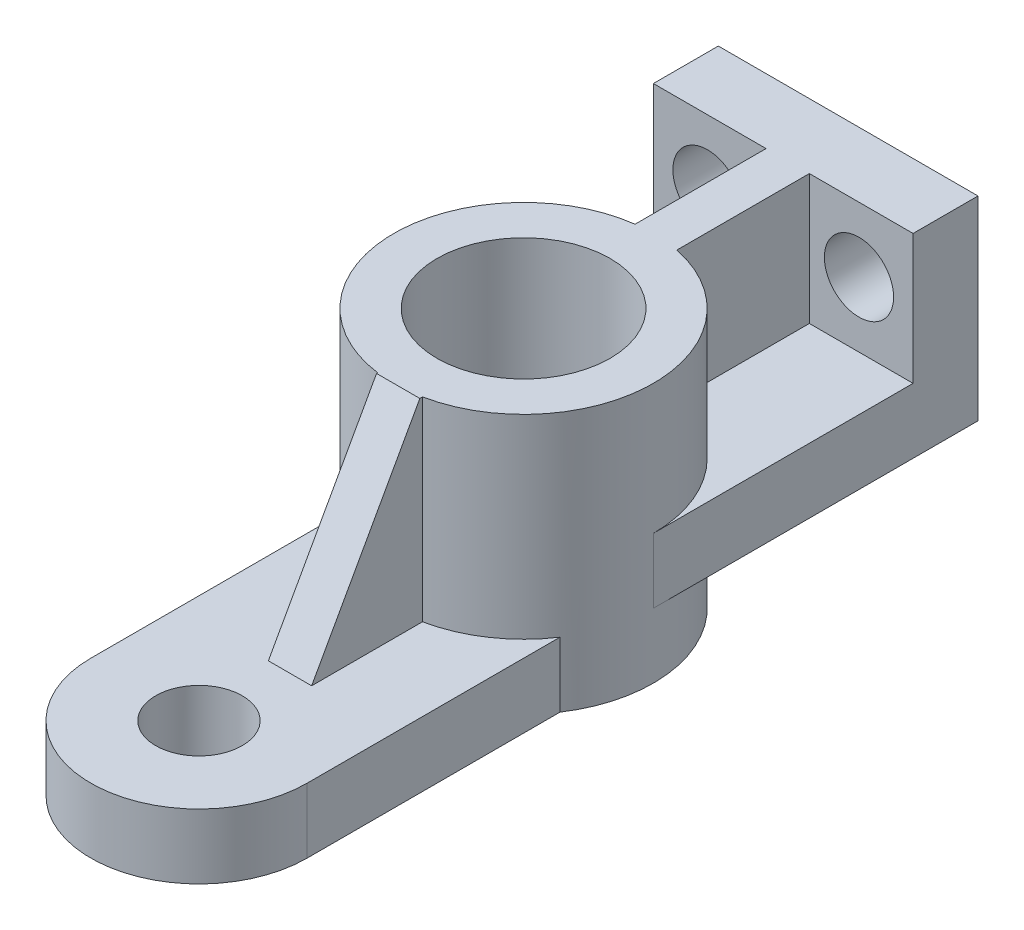
ISO-10303-21;
HEADER;
FILE_DESCRIPTION(('STEP AP214'),'2;1');
FILE_NAME('part.step','',(''),(''),'','','');
FILE_SCHEMA(('AUTOMOTIVE_DESIGN { 1 0 10303 214 1 1 1 1 }'));
ENDSEC;
DATA;
#1=APPLICATION_CONTEXT('core data for automotive mechanical design processes');
#2=APPLICATION_PROTOCOL_DEFINITION('international standard','automotive_design',2000,#1);
#3=PRODUCT_CONTEXT('',#1,'mechanical');
#4=PRODUCT('Part','Part','',(#3));
#5=PRODUCT_RELATED_PRODUCT_CATEGORY('part','',(#4));
#6=PRODUCT_DEFINITION_FORMATION('','',#4);
#7=PRODUCT_DEFINITION_CONTEXT('part definition',#1,'design');
#8=PRODUCT_DEFINITION('design','',#6,#7);
#9=PRODUCT_DEFINITION_SHAPE('','',#8);
#10=(LENGTH_UNIT() NAMED_UNIT(*) SI_UNIT(.MILLI.,.METRE.));
#11=(NAMED_UNIT(*) PLANE_ANGLE_UNIT() SI_UNIT($,.RADIAN.));
#12=(NAMED_UNIT(*) SI_UNIT($,.STERADIAN.) SOLID_ANGLE_UNIT());
#13=UNCERTAINTY_MEASURE_WITH_UNIT(LENGTH_MEASURE(1.E-05),#10,'distance_accuracy_value','');
#14=(GEOMETRIC_REPRESENTATION_CONTEXT(3) GLOBAL_UNCERTAINTY_ASSIGNED_CONTEXT((#13)) GLOBAL_UNIT_ASSIGNED_CONTEXT((#10,
#11,#12)) REPRESENTATION_CONTEXT('',''));
#15=CARTESIAN_POINT('',(0.,0.,0.));
#16=DIRECTION('',(0.,0.,1.));
#17=DIRECTION('',(1.,0.,0.));
#18=AXIS2_PLACEMENT_3D('',#15,#16,#17);
#19=CARTESIAN_POINT('',(-762.,-381.,1905.));
#20=DIRECTION('',(0.,1.,0.));
#21=DIRECTION('',(-1.,0.,0.));
#22=AXIS2_PLACEMENT_3D('',#19,#20,#21);
#23=CYLINDRICAL_SURFACE('',#22,762.);
#24=CARTESIAN_POINT('',(-762.,1143.,1905.));
#25=DIRECTION('',(0.,1.,0.));
#26=DIRECTION('',(-1.,0.,0.));
#27=AXIS2_PLACEMENT_3D('',#24,#25,#26);
#28=CIRCLE('',#27,762.);
#29=CARTESIAN_POINT('',(-608.723112528869,1143.,2651.42494315716));
#30=VERTEX_POINT('',#29);
#31=CARTESIAN_POINT('',(-608.723112528869,1143.,1158.57505684284));
#32=VERTEX_POINT('',#31);
#33=EDGE_CURVE('E56',#30,#32,#28,.T.);
#34=ORIENTED_EDGE('',*,*,#33,.F.);
#35=DIRECTION('',(0.,1.,0.));
#36=VECTOR('',#35,1.);
#37=CARTESIAN_POINT('',(-608.723112528869,-381.,2651.42494315716));
#38=LINE('',#37,#36);
#39=CARTESIAN_POINT('',(-608.723112528869,1.29793307424995E-13,2651.42494315716));
#40=VERTEX_POINT('',#39);
#41=EDGE_CURVE('E184',#30,#40,#38,.F.);
#42=ORIENTED_EDGE('',*,*,#41,.T.);
#43=CARTESIAN_POINT('',(-762.,1.11022302462516E-13,1905.));
#44=DIRECTION('',(0.,-1.,0.));
#45=DIRECTION('',(1.,0.,0.));
#46=AXIS2_PLACEMENT_3D('',#43,#44,#45);
#47=CIRCLE('',#46,762.);
#48=CARTESIAN_POINT('',(-127.,1.88787374208373E-13,2326.21134837514));
#49=VERTEX_POINT('',#48);
#50=EDGE_CURVE('E49',#40,#49,#47,.F.);
#51=ORIENTED_EDGE('',*,*,#50,.T.);
#52=DIRECTION('',(0.,1.,0.));
#53=VECTOR('',#52,1.);
#54=CARTESIAN_POINT('',(-127.,-381.,2326.21134837514));
#55=LINE('',#54,#53);
#56=CARTESIAN_POINT('',(-127.,-381.,2326.21134837514));
#57=VERTEX_POINT('',#56);
#58=EDGE_CURVE('E257',#49,#57,#55,.F.);
#59=ORIENTED_EDGE('',*,*,#58,.T.);
#60=CARTESIAN_POINT('',(-762.,-381.,1905.));
#61=DIRECTION('',(0.,1.,0.));
#62=DIRECTION('',(-1.,0.,0.));
#63=AXIS2_PLACEMENT_3D('',#60,#61,#62);
#64=CIRCLE('',#63,762.);
#65=CARTESIAN_POINT('',(-1397.,-381.,2326.21134837514));
#66=VERTEX_POINT('',#65);
#67=EDGE_CURVE('E287',#57,#66,#64,.T.);
#68=ORIENTED_EDGE('',*,*,#67,.T.);
#69=DIRECTION('',(0.,1.,0.));
#70=VECTOR('',#69,1.);
#71=CARTESIAN_POINT('',(-1397.,-381.,2326.21134837514));
#72=LINE('',#71,#70);
#73=CARTESIAN_POINT('',(-1397.,0.,2326.21134837514));
#74=VERTEX_POINT('',#73);
#75=EDGE_CURVE('E254',#66,#74,#72,.T.);
#76=ORIENTED_EDGE('',*,*,#75,.T.);
#77=CARTESIAN_POINT('',(-862.723112528869,0.,2660.31374580534));
#78=VERTEX_POINT('',#77);
#79=EDGE_CURVE('E11',#74,#78,#47,.F.);
#80=ORIENTED_EDGE('',*,*,#79,.T.);
#81=DIRECTION('',(0.,1.,0.));
#82=VECTOR('',#81,1.);
#83=CARTESIAN_POINT('',(-862.723112528869,-381.,2660.31374580534));
#84=LINE('',#83,#82);
#85=CARTESIAN_POINT('',(-862.723112528869,1143.,2660.31374580534));
#86=VERTEX_POINT('',#85);
#87=EDGE_CURVE('E202',#78,#86,#84,.T.);
#88=ORIENTED_EDGE('',*,*,#87,.T.);
#89=CARTESIAN_POINT('',(-862.723112528869,1143.,1149.68625419466));
#90=VERTEX_POINT('',#89);
#91=EDGE_CURVE('E178',#90,#86,#28,.T.);
#92=ORIENTED_EDGE('',*,*,#91,.F.);
#93=DIRECTION('',(0.,1.,0.));
#94=VECTOR('',#93,1.);
#95=CARTESIAN_POINT('',(-862.723112528869,-381.,1149.68625419466));
#96=LINE('',#95,#94);
#97=CARTESIAN_POINT('',(-862.723112528869,381.,1149.68625419466));
#98=VERTEX_POINT('',#97);
#99=EDGE_CURVE('E273',#90,#98,#96,.F.);
#100=ORIENTED_EDGE('',*,*,#99,.T.);
#101=CARTESIAN_POINT('',(-762.,381.,1905.));
#102=DIRECTION('',(0.,-1.,0.));
#103=DIRECTION('',(1.,0.,0.));
#104=AXIS2_PLACEMENT_3D('',#101,#102,#103);
#105=CIRCLE('',#104,762.);
#106=CARTESIAN_POINT('',(-1524.,381.,1905.));
#107=VERTEX_POINT('',#106);
#108=EDGE_CURVE('E294',#107,#98,#105,.T.);
#109=ORIENTED_EDGE('',*,*,#108,.F.);
#110=DIRECTION('',(0.,-1.,0.));
#111=VECTOR('',#110,1.);
#112=CARTESIAN_POINT('',(-1524.,0.,1905.));
#113=LINE('',#112,#111);
#114=CARTESIAN_POINT('',(-1524.,0.,1905.));
#115=VERTEX_POINT('',#114);
#116=EDGE_CURVE('E307',#107,#115,#113,.T.);
#117=ORIENTED_EDGE('',*,*,#116,.T.);
#118=CARTESIAN_POINT('',(-762.,0.,1905.));
#119=DIRECTION('',(0.,1.,0.));
#120=DIRECTION('',(0.,0.,1.));
#121=AXIS2_PLACEMENT_3D('',#118,#119,#120);
#122=CIRCLE('',#121,762.);
#123=CARTESIAN_POINT('',(0.,0.,1905.));
#124=VERTEX_POINT('',#123);
#125=EDGE_CURVE('E298',#124,#115,#122,.T.);
#126=ORIENTED_EDGE('',*,*,#125,.F.);
#127=DIRECTION('',(0.,1.,0.));
#128=VECTOR('',#127,1.);
#129=CARTESIAN_POINT('',(0.,0.,1905.));
#130=LINE('',#129,#128);
#131=CARTESIAN_POINT('',(0.,381.,1905.));
#132=VERTEX_POINT('',#131);
#133=EDGE_CURVE('E303',#124,#132,#130,.T.);
#134=ORIENTED_EDGE('',*,*,#133,.T.);
#135=CARTESIAN_POINT('',(-608.723112528869,381.,1158.57505684284));
#136=VERTEX_POINT('',#135);
#137=EDGE_CURVE('E290',#136,#132,#105,.T.);
#138=ORIENTED_EDGE('',*,*,#137,.F.);
#139=DIRECTION('',(0.,1.,0.));
#140=VECTOR('',#139,1.);
#141=CARTESIAN_POINT('',(-608.723112528869,-381.,1158.57505684284));
#142=LINE('',#141,#140);
#143=EDGE_CURVE('E284',#136,#32,#142,.T.);
#144=ORIENTED_EDGE('',*,*,#143,.T.);
#145=EDGE_LOOP('',(#34,#42,#51,#59,#68,#76,#80,#88,#92,#100,#109,#117,#126,#134,#138,#144));
#146=FACE_BOUND('',#145,.T.);
#147=ADVANCED_FACE('F39',(#146),#23,.T.);
#148=CARTESIAN_POINT('',(-127.,1.55530143491714E-13,3810.));
#149=DIRECTION('',(0.,-1.,0.));
#150=DIRECTION('',(1.,0.,0.));
#151=AXIS2_PLACEMENT_3D('',#148,#149,#150);
#152=PLANE('',#151);
#153=CARTESIAN_POINT('',(-762.,2.22044604925031E-13,3810.));
#154=DIRECTION('',(0.,-1.,0.));
#155=DIRECTION('',(1.,0.,0.));
#156=AXIS2_PLACEMENT_3D('',#153,#154,#155);
#157=CIRCLE('',#156,254.);
#158=CARTESIAN_POINT('',(-508.,2.53150633623374E-13,3810.));
#159=VERTEX_POINT('',#158);
#160=EDGE_CURVE('E43',#159,#159,#157,.F.);
#161=ORIENTED_EDGE('',*,*,#160,.F.);
#162=EDGE_LOOP('',(#161));
#163=FACE_BOUND('',#162,.T.);
#164=ORIENTED_EDGE('',*,*,#50,.F.);
#165=DIRECTION('',(0.,0.,1.));
#166=VECTOR('',#165,1.);
#167=CARTESIAN_POINT('',(-608.723112528868,0.,2666.9746));
#168=LINE('',#167,#166);
#169=CARTESIAN_POINT('',(-608.723112528868,0.,3301.9746));
#170=VERTEX_POINT('',#169);
#171=EDGE_CURVE('E63',#40,#170,#168,.T.);
#172=ORIENTED_EDGE('',*,*,#171,.T.);
#173=DIRECTION('',(-1.,0.,0.));
#174=VECTOR('',#173,1.);
#175=CARTESIAN_POINT('',(-608.723112528868,0.,3301.9746));
#176=LINE('',#175,#174);
#177=CARTESIAN_POINT('',(-862.723112528868,0.,3301.9746));
#178=VERTEX_POINT('',#177);
#179=EDGE_CURVE('E212',#170,#178,#176,.T.);
#180=ORIENTED_EDGE('',*,*,#179,.T.);
#181=DIRECTION('',(0.,0.,1.));
#182=VECTOR('',#181,1.);
#183=CARTESIAN_POINT('',(-862.723112528868,0.,2666.9746));
#184=LINE('',#183,#182);
#185=EDGE_CURVE('E200',#78,#178,#184,.T.);
#186=ORIENTED_EDGE('',*,*,#185,.F.);
#187=ORIENTED_EDGE('',*,*,#79,.F.);
#188=DIRECTION('',(0.,0.,-1.));
#189=VECTOR('',#188,1.);
#190=CARTESIAN_POINT('',(-1397.,0.,3810.));
#191=LINE('',#190,#189);
#192=CARTESIAN_POINT('',(-1397.,0.,3810.));
#193=VERTEX_POINT('',#192);
#194=EDGE_CURVE('E246',#193,#74,#191,.T.);
#195=ORIENTED_EDGE('',*,*,#194,.F.);
#196=CARTESIAN_POINT('',(-762.,0.,3810.));
#197=DIRECTION('',(0.,1.,0.));
#198=DIRECTION('',(-1.,0.,0.));
#199=AXIS2_PLACEMENT_3D('',#196,#197,#198);
#200=CIRCLE('',#199,635.);
#201=CARTESIAN_POINT('',(-127.,1.55530143491714E-13,3810.));
#202=VERTEX_POINT('',#201);
#203=EDGE_CURVE('E222',#193,#202,#200,.T.);
#204=ORIENTED_EDGE('',*,*,#203,.T.);
#205=DIRECTION('',(0.,0.,-1.));
#206=VECTOR('',#205,1.);
#207=CARTESIAN_POINT('',(-127.,1.55530143491714E-13,3810.));
#208=LINE('',#207,#206);
#209=EDGE_CURVE('E250',#202,#49,#208,.T.);
#210=ORIENTED_EDGE('',*,*,#209,.T.);
#211=EDGE_LOOP('',(#164,#172,#180,#186,#187,#195,#204,#210));
#212=FACE_BOUND('',#211,.T.);
#213=ADVANCED_FACE('F388',(#163,#212),#152,.F.);
#214=CARTESIAN_POINT('',(-762.,2514.55428,1905.));
#215=DIRECTION('',(0.,0.485642931178632,0.874157276121538));
#216=DIRECTION('',(0.,0.874157276121538,-0.485642931178632));
#217=AXIS2_PLACEMENT_3D('',#214,#215,#216);
#218=ELLIPSE('',#217,1569.05403348642,762.);
#219=CARTESIAN_POINT('',(-755.778347900987,1143.,2666.9746));
#220=VERTEX_POINT('',#219);
#221=CARTESIAN_POINT('',(-768.221652098993,1143.,2666.9746));
#222=VERTEX_POINT('',#221);
#223=EDGE_CURVE('E195',#220,#222,#218,.F.);
#224=ORIENTED_EDGE('',*,*,#223,.F.);
#225=EDGE_CURVE('E293',#222,#220,#28,.T.);
#226=ORIENTED_EDGE('',*,*,#225,.F.);
#227=EDGE_LOOP('',(#224,#226));
#228=FACE_BOUND('',#227,.T.);
#229=ADVANCED_FACE('F413',(#228),#23,.T.);
#230=CARTESIAN_POINT('',(0.,0.,381.));
#231=DIRECTION('',(0.,0.,1.));
#232=DIRECTION('',(1.,0.,0.));
#233=AXIS2_PLACEMENT_3D('',#230,#231,#232);
#234=PLANE('',#233);
#235=CARTESIAN_POINT('',(-317.5,762.,381.));
#236=DIRECTION('',(0.,0.,1.));
#237=DIRECTION('',(1.,0.,0.));
#238=AXIS2_PLACEMENT_3D('',#235,#236,#237);
#239=CIRCLE('',#238,203.2);
#240=CARTESIAN_POINT('',(-114.3,762.,381.));
#241=VERTEX_POINT('',#240);
#242=EDGE_CURVE('E329',#241,#241,#239,.T.);
#243=ORIENTED_EDGE('',*,*,#242,.F.);
#244=EDGE_LOOP('',(#243));
#245=FACE_BOUND('',#244,.T.);
#246=DIRECTION('',(-1.,0.,0.));
#247=VECTOR('',#246,1.);
#248=CARTESIAN_POINT('',(0.,1143.,381.));
#249=LINE('',#248,#247);
#250=CARTESIAN_POINT('',(0.,1143.,381.));
#251=VERTEX_POINT('',#250);
#252=CARTESIAN_POINT('',(-608.723112528869,1143.,381.));
#253=VERTEX_POINT('',#252);
#254=EDGE_CURVE('E345',#251,#253,#249,.T.);
#255=ORIENTED_EDGE('',*,*,#254,.T.);
#256=DIRECTION('',(0.,-1.,0.));
#257=VECTOR('',#256,1.);
#258=CARTESIAN_POINT('',(-608.723112528869,1970.35407172504,381.));
#259=LINE('',#258,#257);
#260=CARTESIAN_POINT('',(-608.723112528869,381.,381.));
#261=VERTEX_POINT('',#260);
#262=EDGE_CURVE('E269',#253,#261,#259,.T.);
#263=ORIENTED_EDGE('',*,*,#262,.T.);
#264=DIRECTION('',(-1.,0.,0.));
#265=VECTOR('',#264,1.);
#266=CARTESIAN_POINT('',(0.,381.,381.));
#267=LINE('',#266,#265);
#268=CARTESIAN_POINT('',(0.,381.,381.));
#269=VERTEX_POINT('',#268);
#270=EDGE_CURVE('E308',#269,#261,#267,.T.);
#271=ORIENTED_EDGE('',*,*,#270,.F.);
#272=DIRECTION('',(0.,1.,0.));
#273=VECTOR('',#272,1.);
#274=CARTESIAN_POINT('',(0.,0.,381.));
#275=LINE('',#274,#273);
#276=EDGE_CURVE('E340',#269,#251,#275,.T.);
#277=ORIENTED_EDGE('',*,*,#276,.T.);
#278=EDGE_LOOP('',(#255,#263,#271,#277));
#279=FACE_BOUND('',#278,.T.);
#280=ADVANCED_FACE('F421',(#245,#279),#234,.T.);
#281=CARTESIAN_POINT('',(-1206.5,762.,381.));
#282=DIRECTION('',(0.,0.,1.));
#283=DIRECTION('',(1.,0.,0.));
#284=AXIS2_PLACEMENT_3D('',#281,#282,#283);
#285=CIRCLE('',#284,203.2);
#286=CARTESIAN_POINT('',(-1003.3,762.,381.));
#287=VERTEX_POINT('',#286);
#288=EDGE_CURVE('E323',#287,#287,#285,.T.);
#289=ORIENTED_EDGE('',*,*,#288,.F.);
#290=EDGE_LOOP('',(#289));
#291=FACE_BOUND('',#290,.T.);
#292=CARTESIAN_POINT('',(-862.723112528869,381.,381.));
#293=VERTEX_POINT('',#292);
#294=CARTESIAN_POINT('',(-1524.,381.,381.));
#295=VERTEX_POINT('',#294);
#296=EDGE_CURVE('E302',#293,#295,#267,.T.);
#297=ORIENTED_EDGE('',*,*,#296,.F.);
#298=DIRECTION('',(0.,-1.,0.));
#299=VECTOR('',#298,1.);
#300=CARTESIAN_POINT('',(-862.723112528869,1970.35407172504,381.));
#301=LINE('',#300,#299);
#302=CARTESIAN_POINT('',(-862.723112528869,1143.,381.));
#303=VERTEX_POINT('',#302);
#304=EDGE_CURVE('E266',#303,#293,#301,.T.);
#305=ORIENTED_EDGE('',*,*,#304,.F.);
#306=CARTESIAN_POINT('',(-1524.,1143.,381.));
#307=VERTEX_POINT('',#306);
#308=EDGE_CURVE('E343',#303,#307,#249,.T.);
#309=ORIENTED_EDGE('',*,*,#308,.T.);
#310=DIRECTION('',(0.,-1.,0.));
#311=VECTOR('',#310,1.);
#312=CARTESIAN_POINT('',(-1524.,0.,381.));
#313=LINE('',#312,#311);
#314=EDGE_CURVE('E349',#307,#295,#313,.T.);
#315=ORIENTED_EDGE('',*,*,#314,.T.);
#316=EDGE_LOOP('',(#297,#305,#309,#315));
#317=FACE_BOUND('',#316,.T.);
#318=ADVANCED_FACE('F426',(#291,#317),#234,.T.);
#319=CARTESIAN_POINT('',(0.,381.,1905.));
#320=DIRECTION('',(0.,-1.,0.));
#321=DIRECTION('',(1.,0.,0.));
#322=AXIS2_PLACEMENT_3D('',#319,#320,#321);
#323=PLANE('',#322);
#324=DIRECTION('',(0.,0.,-1.));
#325=VECTOR('',#324,1.);
#326=CARTESIAN_POINT('',(-608.723112528869,381.,381.));
#327=LINE('',#326,#325);
#328=EDGE_CURVE('E261',#136,#261,#327,.T.);
#329=ORIENTED_EDGE('',*,*,#328,.F.);
#330=ORIENTED_EDGE('',*,*,#137,.T.);
#331=DIRECTION('',(0.,0.,-1.));
#332=VECTOR('',#331,1.);
#333=CARTESIAN_POINT('',(0.,381.,1905.));
#334=LINE('',#333,#332);
#335=EDGE_CURVE('E319',#132,#269,#334,.T.);
#336=ORIENTED_EDGE('',*,*,#335,.T.);
#337=ORIENTED_EDGE('',*,*,#270,.T.);
#338=EDGE_LOOP('',(#329,#330,#336,#337));
#339=FACE_BOUND('',#338,.T.);
#340=ADVANCED_FACE('F483',(#339),#323,.F.);
#341=DIRECTION('',(0.,0.,1.));
#342=VECTOR('',#341,1.);
#343=CARTESIAN_POINT('',(-862.723112528869,381.,381.));
#344=LINE('',#343,#342);
#345=EDGE_CURVE('E262',#293,#98,#344,.T.);
#346=ORIENTED_EDGE('',*,*,#345,.F.);
#347=ORIENTED_EDGE('',*,*,#296,.T.);
#348=DIRECTION('',(0.,0.,-1.));
#349=VECTOR('',#348,1.);
#350=CARTESIAN_POINT('',(-1524.,381.,1905.));
#351=LINE('',#350,#349);
#352=EDGE_CURVE('E312',#107,#295,#351,.T.);
#353=ORIENTED_EDGE('',*,*,#352,.F.);
#354=ORIENTED_EDGE('',*,*,#108,.T.);
#355=EDGE_LOOP('',(#346,#347,#353,#354));
#356=FACE_BOUND('',#355,.T.);
#357=ADVANCED_FACE('F466',(#356),#323,.F.);
#358=CARTESIAN_POINT('',(0.,0.,381.));
#359=DIRECTION('',(-1.,0.,0.));
#360=DIRECTION('',(0.,-1.,0.));
#361=AXIS2_PLACEMENT_3D('',#358,#359,#360);
#362=PLANE('',#361);
#363=DIRECTION('',(0.,1.,0.));
#364=VECTOR('',#363,1.);
#365=CARTESIAN_POINT('',(0.,0.,0.));
#366=LINE('',#365,#364);
#367=CARTESIAN_POINT('',(0.,0.,0.));
#368=VERTEX_POINT('',#367);
#369=CARTESIAN_POINT('',(0.,1143.,0.));
#370=VERTEX_POINT('',#369);
#371=EDGE_CURVE('E328',#368,#370,#366,.T.);
#372=ORIENTED_EDGE('',*,*,#371,.T.);
#373=DIRECTION('',(0.,0.,-1.));
#374=VECTOR('',#373,1.);
#375=CARTESIAN_POINT('',(0.,1143.,381.));
#376=LINE('',#375,#374);
#377=EDGE_CURVE('E376',#251,#370,#376,.T.);
#378=ORIENTED_EDGE('',*,*,#377,.F.);
#379=ORIENTED_EDGE('',*,*,#276,.F.);
#380=ORIENTED_EDGE('',*,*,#335,.F.);
#381=ORIENTED_EDGE('',*,*,#133,.F.);
#382=DIRECTION('',(0.,0.,-1.));
#383=VECTOR('',#382,1.);
#384=CARTESIAN_POINT('',(0.,0.,381.));
#385=LINE('',#384,#383);
#386=EDGE_CURVE('E353',#124,#368,#385,.T.);
#387=ORIENTED_EDGE('',*,*,#386,.T.);
#388=EDGE_LOOP('',(#372,#378,#379,#380,#381,#387));
#389=FACE_BOUND('',#388,.T.);
#390=ADVANCED_FACE('F41',(#389),#362,.F.);
#391=CARTESIAN_POINT('',(0.,1143.,381.));
#392=DIRECTION('',(0.,-1.,0.));
#393=DIRECTION('',(1.,0.,0.));
#394=AXIS2_PLACEMENT_3D('',#391,#392,#393);
#395=PLANE('',#394);
#396=CARTESIAN_POINT('',(-762.,1143.,1905.));
#397=DIRECTION('',(0.,-1.,0.));
#398=DIRECTION('',(1.,0.,0.));
#399=AXIS2_PLACEMENT_3D('',#396,#397,#398);
#400=CIRCLE('',#399,508.);
#401=CARTESIAN_POINT('',(-254.,1143.,1905.));
#402=VERTEX_POINT('',#401);
#403=EDGE_CURVE('E436',#402,#402,#400,.T.);
#404=ORIENTED_EDGE('',*,*,#403,.T.);
#405=EDGE_LOOP('',(#404));
#406=FACE_BOUND('',#405,.T.);
#407=ORIENTED_EDGE('',*,*,#91,.T.);
#408=DIRECTION('',(0.,0.,1.));
#409=VECTOR('',#408,1.);
#410=CARTESIAN_POINT('',(-862.723112528869,1143.,2641.5746));
#411=LINE('',#410,#409);
#412=CARTESIAN_POINT('',(-862.723112528869,1143.,2666.9746));
#413=VERTEX_POINT('',#412);
#414=EDGE_CURVE('E171',#86,#413,#411,.T.);
#415=ORIENTED_EDGE('',*,*,#414,.T.);
#416=DIRECTION('',(-1.,0.,0.));
#417=VECTOR('',#416,1.);
#418=CARTESIAN_POINT('',(-608.723112528869,1143.,2666.9746));
#419=LINE('',#418,#417);
#420=EDGE_CURVE('E175',#222,#413,#419,.T.);
#421=ORIENTED_EDGE('',*,*,#420,.F.);
#422=ORIENTED_EDGE('',*,*,#225,.T.);
#423=CARTESIAN_POINT('',(-608.723112528869,1143.,2666.9746));
#424=VERTEX_POINT('',#423);
#425=EDGE_CURVE('E197',#424,#220,#419,.T.);
#426=ORIENTED_EDGE('',*,*,#425,.F.);
#427=DIRECTION('',(0.,0.,1.));
#428=VECTOR('',#427,1.);
#429=CARTESIAN_POINT('',(-608.723112528869,1143.,2641.5746));
#430=LINE('',#429,#428);
#431=EDGE_CURVE('E185',#30,#424,#430,.T.);
#432=ORIENTED_EDGE('',*,*,#431,.F.);
#433=ORIENTED_EDGE('',*,*,#33,.T.);
#434=DIRECTION('',(0.,0.,-1.));
#435=VECTOR('',#434,1.);
#436=CARTESIAN_POINT('',(-608.723112528869,1143.,381.));
#437=LINE('',#436,#435);
#438=EDGE_CURVE('E265',#32,#253,#437,.T.);
#439=ORIENTED_EDGE('',*,*,#438,.T.);
#440=ORIENTED_EDGE('',*,*,#254,.F.);
#441=ORIENTED_EDGE('',*,*,#377,.T.);
#442=DIRECTION('',(-1.,0.,0.));
#443=VECTOR('',#442,1.);
#444=CARTESIAN_POINT('',(0.,1143.,0.));
#445=LINE('',#444,#443);
#446=CARTESIAN_POINT('',(-1524.,1143.,0.));
#447=VERTEX_POINT('',#446);
#448=EDGE_CURVE('E357',#370,#447,#445,.T.);
#449=ORIENTED_EDGE('',*,*,#448,.T.);
#450=DIRECTION('',(0.,0.,-1.));
#451=VECTOR('',#450,1.);
#452=CARTESIAN_POINT('',(-1524.,1143.,381.));
#453=LINE('',#452,#451);
#454=EDGE_CURVE('E372',#307,#447,#453,.T.);
#455=ORIENTED_EDGE('',*,*,#454,.F.);
#456=ORIENTED_EDGE('',*,*,#308,.F.);
#457=DIRECTION('',(0.,0.,1.));
#458=VECTOR('',#457,1.);
#459=CARTESIAN_POINT('',(-862.723112528869,1143.,381.));
#460=LINE('',#459,#458);
#461=EDGE_CURVE('E270',#303,#90,#460,.T.);
#462=ORIENTED_EDGE('',*,*,#461,.T.);
#463=EDGE_LOOP('',(#407,#415,#421,#422,#426,#432,#433,#439,#440,#441,#449,#455,#456,#462));
#464=FACE_BOUND('',#463,.T.);
#465=ADVANCED_FACE('F173',(#406,#464),#395,.F.);
#466=CARTESIAN_POINT('',(-1524.,0.,381.));
#467=DIRECTION('',(1.,0.,0.));
#468=DIRECTION('',(0.,0.,-1.));
#469=AXIS2_PLACEMENT_3D('',#466,#467,#468);
#470=PLANE('',#469);
#471=DIRECTION('',(0.,-1.,0.));
#472=VECTOR('',#471,1.);
#473=CARTESIAN_POINT('',(-1524.,0.,0.));
#474=LINE('',#473,#472);
#475=CARTESIAN_POINT('',(-1524.,0.,0.));
#476=VERTEX_POINT('',#475);
#477=EDGE_CURVE('E360',#447,#476,#474,.T.);
#478=ORIENTED_EDGE('',*,*,#477,.T.);
#479=DIRECTION('',(0.,0.,-1.));
#480=VECTOR('',#479,1.);
#481=CARTESIAN_POINT('',(-1524.,0.,381.));
#482=LINE('',#481,#480);
#483=EDGE_CURVE('E368',#115,#476,#482,.T.);
#484=ORIENTED_EDGE('',*,*,#483,.F.);
#485=ORIENTED_EDGE('',*,*,#116,.F.);
#486=ORIENTED_EDGE('',*,*,#352,.T.);
#487=ORIENTED_EDGE('',*,*,#314,.F.);
#488=ORIENTED_EDGE('',*,*,#454,.T.);
#489=EDGE_LOOP('',(#478,#484,#485,#486,#487,#488));
#490=FACE_BOUND('',#489,.T.);
#491=ADVANCED_FACE('F458',(#490),#470,.F.);
#492=CARTESIAN_POINT('',(0.,0.,381.));
#493=DIRECTION('',(0.,1.,0.));
#494=DIRECTION('',(0.,0.,1.));
#495=AXIS2_PLACEMENT_3D('',#492,#493,#494);
#496=PLANE('',#495);
#497=ORIENTED_EDGE('',*,*,#386,.F.);
#498=ORIENTED_EDGE('',*,*,#125,.T.);
#499=ORIENTED_EDGE('',*,*,#483,.T.);
#500=DIRECTION('',(1.,0.,0.));
#501=VECTOR('',#500,1.);
#502=CARTESIAN_POINT('',(0.,0.,0.));
#503=LINE('',#502,#501);
#504=EDGE_CURVE('E344',#476,#368,#503,.T.);
#505=ORIENTED_EDGE('',*,*,#504,.T.);
#506=EDGE_LOOP('',(#497,#498,#499,#505));
#507=FACE_BOUND('',#506,.T.);
#508=ADVANCED_FACE('F463',(#507),#496,.F.);
#509=CARTESIAN_POINT('',(0.,0.,0.));
#510=DIRECTION('',(0.,0.,1.));
#511=DIRECTION('',(1.,0.,0.));
#512=AXIS2_PLACEMENT_3D('',#509,#510,#511);
#513=PLANE('',#512);
#514=CARTESIAN_POINT('',(-317.5,762.,0.));
#515=DIRECTION('',(0.,0.,1.));
#516=DIRECTION('',(1.,0.,0.));
#517=AXIS2_PLACEMENT_3D('',#514,#515,#516);
#518=CIRCLE('',#517,203.2);
#519=CARTESIAN_POINT('',(-114.3,762.,0.));
#520=VERTEX_POINT('',#519);
#521=EDGE_CURVE('E324',#520,#520,#518,.T.);
#522=ORIENTED_EDGE('',*,*,#521,.T.);
#523=EDGE_LOOP('',(#522));
#524=FACE_BOUND('',#523,.T.);
#525=CARTESIAN_POINT('',(-1206.5,762.,0.));
#526=DIRECTION('',(0.,0.,1.));
#527=DIRECTION('',(1.,0.,0.));
#528=AXIS2_PLACEMENT_3D('',#525,#526,#527);
#529=CIRCLE('',#528,203.2);
#530=CARTESIAN_POINT('',(-1003.3,762.,0.));
#531=VERTEX_POINT('',#530);
#532=EDGE_CURVE('E333',#531,#531,#529,.T.);
#533=ORIENTED_EDGE('',*,*,#532,.T.);
#534=EDGE_LOOP('',(#533));
#535=FACE_BOUND('',#534,.T.);
#536=ORIENTED_EDGE('',*,*,#371,.F.);
#537=ORIENTED_EDGE('',*,*,#504,.F.);
#538=ORIENTED_EDGE('',*,*,#477,.F.);
#539=ORIENTED_EDGE('',*,*,#448,.F.);
#540=EDGE_LOOP('',(#536,#537,#538,#539));
#541=FACE_BOUND('',#540,.T.);
#542=ADVANCED_FACE('F471',(#524,#535,#541),#513,.F.);
#543=CARTESIAN_POINT('',(-1206.5,762.,0.));
#544=DIRECTION('',(0.,0.,1.));
#545=DIRECTION('',(1.,0.,0.));
#546=AXIS2_PLACEMENT_3D('',#543,#544,#545);
#547=CYLINDRICAL_SURFACE('',#546,203.2);
#548=ORIENTED_EDGE('',*,*,#532,.F.);
#549=EDGE_LOOP('',(#548));
#550=FACE_BOUND('',#549,.T.);
#551=ORIENTED_EDGE('',*,*,#288,.T.);
#552=EDGE_LOOP('',(#551));
#553=FACE_BOUND('',#552,.T.);
#554=ADVANCED_FACE('F474',(#550,#553),#547,.F.);
#555=CARTESIAN_POINT('',(-317.5,762.,0.));
#556=DIRECTION('',(0.,0.,1.));
#557=DIRECTION('',(1.,0.,0.));
#558=AXIS2_PLACEMENT_3D('',#555,#556,#557);
#559=CYLINDRICAL_SURFACE('',#558,203.2);
#560=ORIENTED_EDGE('',*,*,#521,.F.);
#561=EDGE_LOOP('',(#560));
#562=FACE_BOUND('',#561,.T.);
#563=ORIENTED_EDGE('',*,*,#242,.T.);
#564=EDGE_LOOP('',(#563));
#565=FACE_BOUND('',#564,.T.);
#566=ADVANCED_FACE('F479',(#562,#565),#559,.F.);
#567=CARTESIAN_POINT('',(-762.,-381.,1905.));
#568=DIRECTION('',(0.,1.,0.));
#569=DIRECTION('',(-1.,0.,0.));
#570=AXIS2_PLACEMENT_3D('',#567,#568,#569);
#571=PLANE('',#570);
#572=CARTESIAN_POINT('',(-762.,-381.,1905.));
#573=DIRECTION('',(0.,1.,0.));
#574=DIRECTION('',(-1.,0.,0.));
#575=AXIS2_PLACEMENT_3D('',#572,#573,#574);
#576=CIRCLE('',#575,508.);
#577=CARTESIAN_POINT('',(-1270.,-381.000000000001,1905.));
#578=VERTEX_POINT('',#577);
#579=EDGE_CURVE('E440',#578,#578,#576,.T.);
#580=ORIENTED_EDGE('',*,*,#579,.T.);
#581=EDGE_LOOP('',(#580));
#582=FACE_BOUND('',#581,.T.);
#583=CARTESIAN_POINT('',(-762.,-381.,3810.));
#584=DIRECTION('',(0.,1.,0.));
#585=DIRECTION('',(-1.,0.,0.));
#586=AXIS2_PLACEMENT_3D('',#583,#584,#585);
#587=CIRCLE('',#586,254.);
#588=CARTESIAN_POINT('',(-1016.,-381.,3810.));
#589=VERTEX_POINT('',#588);
#590=EDGE_CURVE('E218',#589,#589,#587,.T.);
#591=ORIENTED_EDGE('',*,*,#590,.T.);
#592=EDGE_LOOP('',(#591));
#593=FACE_BOUND('',#592,.T.);
#594=DIRECTION('',(0.,0.,-1.));
#595=VECTOR('',#594,1.);
#596=CARTESIAN_POINT('',(-127.,-381.,3810.));
#597=LINE('',#596,#595);
#598=CARTESIAN_POINT('',(-127.,-381.,3810.));
#599=VERTEX_POINT('',#598);
#600=EDGE_CURVE('E238',#599,#57,#597,.T.);
#601=ORIENTED_EDGE('',*,*,#600,.F.);
#602=CARTESIAN_POINT('',(-762.,-381.,3810.));
#603=DIRECTION('',(0.,1.,0.));
#604=DIRECTION('',(-1.,0.,0.));
#605=AXIS2_PLACEMENT_3D('',#602,#603,#604);
#606=CIRCLE('',#605,635.);
#607=CARTESIAN_POINT('',(-1397.,-381.,3810.));
#608=VERTEX_POINT('',#607);
#609=EDGE_CURVE('E226',#599,#608,#606,.F.);
#610=ORIENTED_EDGE('',*,*,#609,.T.);
#611=DIRECTION('',(0.,0.,-1.));
#612=VECTOR('',#611,1.);
#613=CARTESIAN_POINT('',(-1397.,-381.,3810.));
#614=LINE('',#613,#612);
#615=EDGE_CURVE('E242',#608,#66,#614,.T.);
#616=ORIENTED_EDGE('',*,*,#615,.T.);
#617=ORIENTED_EDGE('',*,*,#67,.F.);
#618=EDGE_LOOP('',(#601,#610,#616,#617));
#619=FACE_BOUND('',#618,.T.);
#620=ADVANCED_FACE('F396',(#582,#593,#619),#571,.F.);
#621=CARTESIAN_POINT('',(-608.723112528869,1970.35407172504,381.));
#622=DIRECTION('',(-1.,0.,0.));
#623=DIRECTION('',(0.,0.,1.));
#624=AXIS2_PLACEMENT_3D('',#621,#622,#623);
#625=PLANE('',#624);
#626=ORIENTED_EDGE('',*,*,#143,.F.);
#627=ORIENTED_EDGE('',*,*,#328,.T.);
#628=ORIENTED_EDGE('',*,*,#262,.F.);
#629=ORIENTED_EDGE('',*,*,#438,.F.);
#630=EDGE_LOOP('',(#626,#627,#628,#629));
#631=FACE_BOUND('',#630,.T.);
#632=ADVANCED_FACE('F516',(#631),#625,.F.);
#633=CARTESIAN_POINT('',(-862.723112528869,1970.35407172504,381.));
#634=DIRECTION('',(1.,0.,0.));
#635=DIRECTION('',(0.,0.,-1.));
#636=AXIS2_PLACEMENT_3D('',#633,#634,#635);
#637=PLANE('',#636);
#638=ORIENTED_EDGE('',*,*,#99,.F.);
#639=ORIENTED_EDGE('',*,*,#461,.F.);
#640=ORIENTED_EDGE('',*,*,#304,.T.);
#641=ORIENTED_EDGE('',*,*,#345,.T.);
#642=EDGE_LOOP('',(#638,#639,#640,#641));
#643=FACE_BOUND('',#642,.T.);
#644=ADVANCED_FACE('F408',(#643),#637,.F.);
#645=CARTESIAN_POINT('',(-127.,-381.,3810.));
#646=DIRECTION('',(-1.,0.,0.));
#647=DIRECTION('',(0.,0.,1.));
#648=AXIS2_PLACEMENT_3D('',#645,#646,#647);
#649=PLANE('',#648);
#650=ORIENTED_EDGE('',*,*,#58,.F.);
#651=ORIENTED_EDGE('',*,*,#209,.F.);
#652=DIRECTION('',(0.,1.,0.));
#653=VECTOR('',#652,1.);
#654=CARTESIAN_POINT('',(-127.,-381.,3810.));
#655=LINE('',#654,#653);
#656=EDGE_CURVE('E230',#599,#202,#655,.T.);
#657=ORIENTED_EDGE('',*,*,#656,.F.);
#658=ORIENTED_EDGE('',*,*,#600,.T.);
#659=EDGE_LOOP('',(#650,#651,#657,#658));
#660=FACE_BOUND('',#659,.T.);
#661=ADVANCED_FACE('F386',(#660),#649,.F.);
#662=CARTESIAN_POINT('',(-1397.,-381.,3810.));
#663=DIRECTION('',(1.,0.,0.));
#664=DIRECTION('',(0.,0.,-1.));
#665=AXIS2_PLACEMENT_3D('',#662,#663,#664);
#666=PLANE('',#665);
#667=ORIENTED_EDGE('',*,*,#75,.F.);
#668=ORIENTED_EDGE('',*,*,#615,.F.);
#669=DIRECTION('',(0.,-1.,0.));
#670=VECTOR('',#669,1.);
#671=CARTESIAN_POINT('',(-1397.,-381.,3810.));
#672=LINE('',#671,#670);
#673=EDGE_CURVE('E234',#193,#608,#672,.T.);
#674=ORIENTED_EDGE('',*,*,#673,.F.);
#675=ORIENTED_EDGE('',*,*,#194,.T.);
#676=EDGE_LOOP('',(#667,#668,#674,#675));
#677=FACE_BOUND('',#676,.T.);
#678=ADVANCED_FACE('F399',(#677),#666,.F.);
#679=CARTESIAN_POINT('',(-762.,-2177.05122421383,3810.));
#680=DIRECTION('',(0.,1.,0.));
#681=DIRECTION('',(-1.,0.,0.));
#682=AXIS2_PLACEMENT_3D('',#679,#680,#681);
#683=CYLINDRICAL_SURFACE('',#682,635.);
#684=ORIENTED_EDGE('',*,*,#609,.F.);
#685=ORIENTED_EDGE('',*,*,#656,.T.);
#686=ORIENTED_EDGE('',*,*,#203,.F.);
#687=ORIENTED_EDGE('',*,*,#673,.T.);
#688=EDGE_LOOP('',(#684,#685,#686,#687));
#689=FACE_BOUND('',#688,.T.);
#690=ADVANCED_FACE('F394',(#689),#683,.T.);
#691=CARTESIAN_POINT('',(-762.,1143.,3810.));
#692=DIRECTION('',(0.,-1.,0.));
#693=DIRECTION('',(1.,0.,0.));
#694=AXIS2_PLACEMENT_3D('',#691,#692,#693);
#695=CYLINDRICAL_SURFACE('',#694,254.);
#696=ORIENTED_EDGE('',*,*,#590,.F.);
#697=EDGE_LOOP('',(#696));
#698=FACE_BOUND('',#697,.T.);
#699=ORIENTED_EDGE('',*,*,#160,.T.);
#700=EDGE_LOOP('',(#699));
#701=FACE_BOUND('',#700,.T.);
#702=ADVANCED_FACE('F406',(#698,#701),#695,.F.);
#703=CARTESIAN_POINT('',(-608.723112528868,0.,3301.9746));
#704=DIRECTION('',(0.,0.485642931178632,0.874157276121538));
#705=DIRECTION('',(0.,-0.874157276121538,0.485642931178632));
#706=AXIS2_PLACEMENT_3D('',#703,#704,#705);
#707=PLANE('',#706);
#708=ORIENTED_EDGE('',*,*,#425,.T.);
#709=ORIENTED_EDGE('',*,*,#223,.T.);
#710=ORIENTED_EDGE('',*,*,#420,.T.);
#711=DIRECTION('',(0.,0.874157276121538,-0.485642931178632));
#712=VECTOR('',#711,1.);
#713=CARTESIAN_POINT('',(-862.723112528868,0.,3301.9746));
#714=LINE('',#713,#712);
#715=EDGE_CURVE('E193',#178,#413,#714,.T.);
#716=ORIENTED_EDGE('',*,*,#715,.F.);
#717=ORIENTED_EDGE('',*,*,#179,.F.);
#718=DIRECTION('',(0.,0.874157276121538,-0.485642931178632));
#719=VECTOR('',#718,1.);
#720=CARTESIAN_POINT('',(-608.723112528868,0.,3301.9746));
#721=LINE('',#720,#719);
#722=EDGE_CURVE('E206',#170,#424,#721,.T.);
#723=ORIENTED_EDGE('',*,*,#722,.T.);
#724=EDGE_LOOP('',(#708,#709,#710,#716,#717,#723));
#725=FACE_BOUND('',#724,.T.);
#726=ADVANCED_FACE('F191',(#725),#707,.T.);
#727=CARTESIAN_POINT('',(-608.723112528869,0.,1.15023371903536E-13));
#728=DIRECTION('',(1.,0.,0.));
#729=DIRECTION('',(0.,0.,-1.));
#730=AXIS2_PLACEMENT_3D('',#727,#728,#729);
#731=PLANE('',#730);
#732=ORIENTED_EDGE('',*,*,#722,.F.);
#733=ORIENTED_EDGE('',*,*,#171,.F.);
#734=ORIENTED_EDGE('',*,*,#41,.F.);
#735=ORIENTED_EDGE('',*,*,#431,.T.);
#736=EDGE_LOOP('',(#732,#733,#734,#735));
#737=FACE_BOUND('',#736,.T.);
#738=ADVANCED_FACE('F434',(#737),#731,.T.);
#739=CARTESIAN_POINT('',(-862.723112528869,0.,1.50837017859186E-13));
#740=DIRECTION('',(1.,0.,0.));
#741=DIRECTION('',(0.,0.,-1.));
#742=AXIS2_PLACEMENT_3D('',#739,#740,#741);
#743=PLANE('',#742);
#744=ORIENTED_EDGE('',*,*,#715,.T.);
#745=ORIENTED_EDGE('',*,*,#414,.F.);
#746=ORIENTED_EDGE('',*,*,#87,.F.);
#747=ORIENTED_EDGE('',*,*,#185,.T.);
#748=EDGE_LOOP('',(#744,#745,#746,#747));
#749=FACE_BOUND('',#748,.T.);
#750=ADVANCED_FACE('F199',(#749),#743,.F.);
#751=CARTESIAN_POINT('',(-762.,-381.,1905.));
#752=DIRECTION('',(0.,1.,0.));
#753=DIRECTION('',(-1.,0.,0.));
#754=AXIS2_PLACEMENT_3D('',#751,#752,#753);
#755=CYLINDRICAL_SURFACE('',#754,508.);
#756=ORIENTED_EDGE('',*,*,#579,.F.);
#757=EDGE_LOOP('',(#756));
#758=FACE_BOUND('',#757,.T.);
#759=ORIENTED_EDGE('',*,*,#403,.F.);
#760=EDGE_LOOP('',(#759));
#761=FACE_BOUND('',#760,.T.);
#762=ADVANCED_FACE('F451',(#758,#761),#755,.F.);
#763=CLOSED_SHELL('',(#147,#213,#229,#280,#318,#340,#357,#390,#465,#491,#508,#542,#554,#566,
#620,#632,#644,#661,#678,#690,#702,#726,#738,#750,#762));
#764=MANIFOLD_SOLID_BREP('B2',#763);
#765=ADVANCED_BREP_SHAPE_REPRESENTATION('',(#18,#764),#14);
#766=SHAPE_DEFINITION_REPRESENTATION(#9,#765);
ENDSEC;
END-ISO-10303-21;
